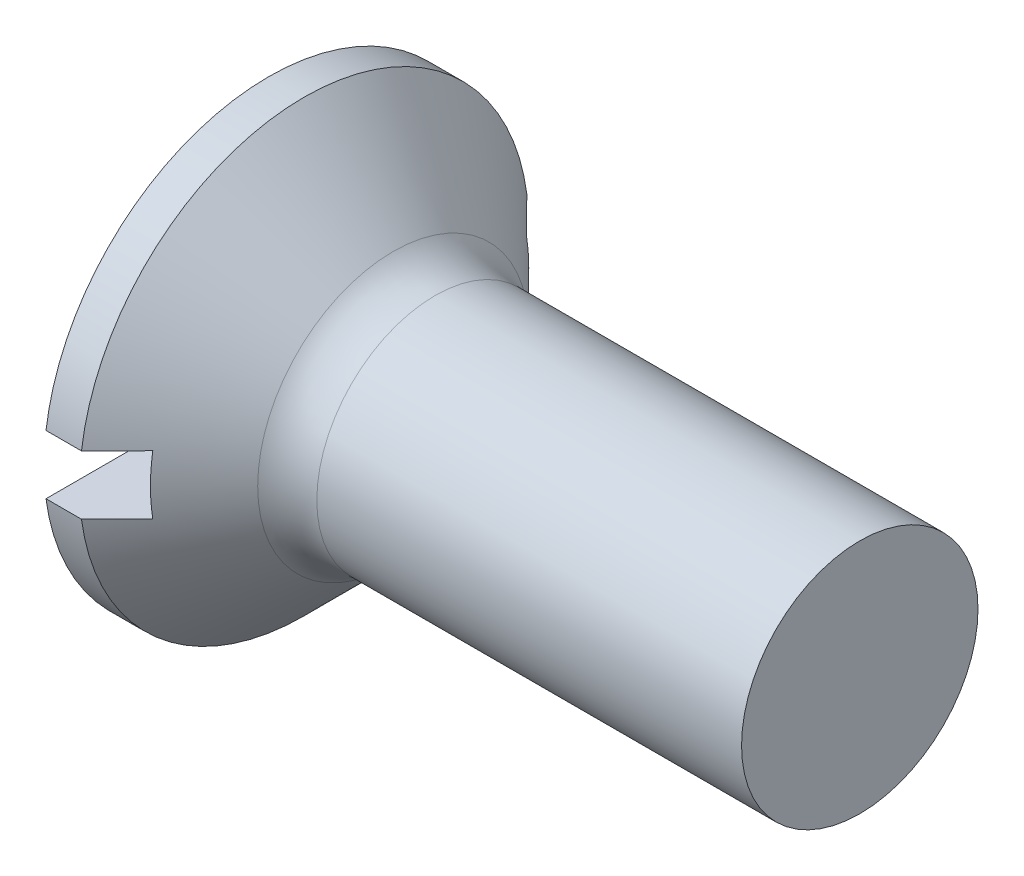
ISO-10303-21;
HEADER;
FILE_DESCRIPTION(('STEP AP214'),'2;1');
FILE_NAME('part.step','',(''),(''),'','','');
FILE_SCHEMA(('AUTOMOTIVE_DESIGN { 1 0 10303 214 1 1 1 1 }'));
ENDSEC;
DATA;
#1=APPLICATION_CONTEXT('core data for automotive mechanical design processes');
#2=APPLICATION_PROTOCOL_DEFINITION('international standard','automotive_design',2000,#1);
#3=PRODUCT_CONTEXT('',#1,'mechanical');
#4=PRODUCT('Part','Part','',(#3));
#5=PRODUCT_RELATED_PRODUCT_CATEGORY('part','',(#4));
#6=PRODUCT_DEFINITION_FORMATION('','',#4);
#7=PRODUCT_DEFINITION_CONTEXT('part definition',#1,'design');
#8=PRODUCT_DEFINITION('design','',#6,#7);
#9=PRODUCT_DEFINITION_SHAPE('','',#8);
#10=(LENGTH_UNIT() NAMED_UNIT(*) SI_UNIT(.MILLI.,.METRE.));
#11=(NAMED_UNIT(*) PLANE_ANGLE_UNIT() SI_UNIT($,.RADIAN.));
#12=(NAMED_UNIT(*) SI_UNIT($,.STERADIAN.) SOLID_ANGLE_UNIT());
#13=UNCERTAINTY_MEASURE_WITH_UNIT(LENGTH_MEASURE(1.E-05),#10,'distance_accuracy_value','');
#14=(GEOMETRIC_REPRESENTATION_CONTEXT(3) GLOBAL_UNCERTAINTY_ASSIGNED_CONTEXT((#13)) GLOBAL_UNIT_ASSIGNED_CONTEXT((#10,
#11,#12)) REPRESENTATION_CONTEXT('',''));
#15=CARTESIAN_POINT('',(0.,0.,0.));
#16=DIRECTION('',(0.,0.,1.));
#17=DIRECTION('',(1.,0.,0.));
#18=AXIS2_PLACEMENT_3D('',#15,#16,#17);
#19=CARTESIAN_POINT('',(0.,0.,0.));
#20=DIRECTION('',(-1.,0.,0.));
#21=DIRECTION('',(0.,0.,1.));
#22=AXIS2_PLACEMENT_3D('',#19,#20,#21);
#23=PLANE('',#22);
#24=DIRECTION('',(0.,0.,-1.));
#25=VECTOR('',#24,1.);
#26=CARTESIAN_POINT('',(0.,0.25,1.9));
#27=LINE('',#26,#25);
#28=CARTESIAN_POINT('',(0.,0.25,1.88348082018374));
#29=VERTEX_POINT('',#28);
#30=CARTESIAN_POINT('',(0.,0.25,-1.88348082018374));
#31=VERTEX_POINT('',#30);
#32=EDGE_CURVE('E176',#29,#31,#27,.T.);
#33=ORIENTED_EDGE('',*,*,#32,.F.);
#34=CARTESIAN_POINT('',(0.,0.,0.));
#35=DIRECTION('',(-1.,0.,0.));
#36=DIRECTION('',(0.,0.,1.));
#37=AXIS2_PLACEMENT_3D('',#34,#35,#36);
#38=CIRCLE('',#37,1.9);
#39=EDGE_CURVE('E141',#29,#31,#38,.T.);
#40=ORIENTED_EDGE('',*,*,#39,.T.);
#41=EDGE_LOOP('',(#33,#40));
#42=FACE_BOUND('',#41,.T.);
#43=ADVANCED_FACE('F35',(#42),#23,.T.);
#44=CARTESIAN_POINT('',(-6.34999999999999,0.,0.));
#45=DIRECTION('',(-1.,0.,0.));
#46=DIRECTION('',(0.,0.,1.));
#47=AXIS2_PLACEMENT_3D('',#44,#45,#46);
#48=CYLINDRICAL_SURFACE('',#47,1.9);
#49=DIRECTION('',(-1.,0.,0.));
#50=VECTOR('',#49,1.);
#51=CARTESIAN_POINT('',(-6.34999999999999,0.25,-1.88348082018374));
#52=LINE('',#51,#50);
#53=CARTESIAN_POINT('',(0.299999999999989,0.25,-1.88348082018376));
#54=VERTEX_POINT('',#53);
#55=EDGE_CURVE('E63',#31,#54,#52,.F.);
#56=ORIENTED_EDGE('',*,*,#55,.F.);
#57=ORIENTED_EDGE('',*,*,#39,.F.);
#58=DIRECTION('',(-1.,0.,0.));
#59=VECTOR('',#58,1.);
#60=CARTESIAN_POINT('',(-6.34999999999999,0.25,1.88348082018374));
#61=LINE('',#60,#59);
#62=CARTESIAN_POINT('',(0.300000000000003,0.25,1.88348082018374));
#63=VERTEX_POINT('',#62);
#64=EDGE_CURVE('E182',#63,#29,#61,.T.);
#65=ORIENTED_EDGE('',*,*,#64,.F.);
#66=CARTESIAN_POINT('',(0.300000000000003,0.,0.));
#67=DIRECTION('',(-1.,0.,0.));
#68=DIRECTION('',(0.,0.,1.));
#69=AXIS2_PLACEMENT_3D('',#66,#67,#68);
#70=CIRCLE('',#69,1.9);
#71=EDGE_CURVE('E112',#63,#54,#70,.T.);
#72=ORIENTED_EDGE('',*,*,#71,.T.);
#73=EDGE_LOOP('',(#56,#57,#65,#72));
#74=FACE_BOUND('',#73,.T.);
#75=ADVANCED_FACE('F163',(#74),#48,.T.);
#76=DIRECTION('',(0.,0.,1.));
#77=VECTOR('',#76,1.);
#78=CARTESIAN_POINT('',(0.,-0.250000000000001,-1.9));
#79=LINE('',#78,#77);
#80=CARTESIAN_POINT('',(0.,-0.250000000000001,-1.88348082018374));
#81=VERTEX_POINT('',#80);
#82=CARTESIAN_POINT('',(0.,-0.250000000000001,1.88348082018374));
#83=VERTEX_POINT('',#82);
#84=EDGE_CURVE('E106',#81,#83,#79,.T.);
#85=ORIENTED_EDGE('',*,*,#84,.F.);
#86=EDGE_CURVE('E131',#81,#83,#38,.T.);
#87=ORIENTED_EDGE('',*,*,#86,.T.);
#88=EDGE_LOOP('',(#85,#87));
#89=FACE_BOUND('',#88,.T.);
#90=ADVANCED_FACE('F161',(#89),#23,.T.);
#91=DIRECTION('',(-1.,0.,0.));
#92=VECTOR('',#91,1.);
#93=CARTESIAN_POINT('',(-6.34999999999999,-0.250000000000001,1.88348082018374));
#94=LINE('',#93,#92);
#95=CARTESIAN_POINT('',(0.299999999999989,-0.250000000000001,1.88348082018376));
#96=VERTEX_POINT('',#95);
#97=EDGE_CURVE('E132',#83,#96,#94,.F.);
#98=ORIENTED_EDGE('',*,*,#97,.F.);
#99=ORIENTED_EDGE('',*,*,#86,.F.);
#100=DIRECTION('',(-1.,0.,0.));
#101=VECTOR('',#100,1.);
#102=CARTESIAN_POINT('',(-6.34999999999999,-0.250000000000001,-1.88348082018374));
#103=LINE('',#102,#101);
#104=CARTESIAN_POINT('',(0.300000000000003,-0.250000000000001,-1.88348082018374));
#105=VERTEX_POINT('',#104);
#106=EDGE_CURVE('E121',#105,#81,#103,.T.);
#107=ORIENTED_EDGE('',*,*,#106,.F.);
#108=EDGE_CURVE('E129',#105,#96,#70,.T.);
#109=ORIENTED_EDGE('',*,*,#108,.T.);
#110=EDGE_LOOP('',(#98,#99,#107,#109));
#111=FACE_BOUND('',#110,.T.);
#112=ADVANCED_FACE('F128',(#111),#48,.T.);
#113=CARTESIAN_POINT('',(0.300000000000003,0.,0.));
#114=DIRECTION('',(-1.,0.,0.));
#115=DIRECTION('',(0.,0.,1.));
#116=AXIS2_PLACEMENT_3D('',#113,#114,#115);
#117=CONICAL_SURFACE('',#116,1.9,0.78539816339745);
#118=CARTESIAN_POINT('',(-1.98729422630551,0.25,-4.17982451038935));
#119=CARTESIAN_POINT('',(-1.84470913533547,0.25,-4.03698256603225));
#120=CARTESIAN_POINT('',(-1.70213517655014,0.25,-3.89412950070456));
#121=CARTESIAN_POINT('',(-1.41702186757104,0.25,-3.60838492143172));
#122=CARTESIAN_POINT('',(-1.27448251787976,0.25,-3.46549340698522));
#123=CARTESIAN_POINT('',(-0.989410499152169,0.25,-3.17961533117565));
#124=CARTESIAN_POINT('',(-0.846877845892992,0.25,-3.03662875407935));
#125=CARTESIAN_POINT('',(-0.561891165052778,0.25,-2.75058105917093));
#126=CARTESIAN_POINT('',(-0.419437136443918,0.25,-2.60751994238315));
#127=CARTESIAN_POINT('',(-0.131064292348537,0.25,-2.3176668049941));
#128=CARTESIAN_POINT('',(0.0148513539907664,0.25,-2.17087163179214));
#129=CARTESIAN_POINT('',(0.306462720413094,0.25,-1.87705115433807));
#130=CARTESIAN_POINT('',(0.452158431570259,0.25,-1.73002584121432));
#131=CARTESIAN_POINT('',(0.670327706151663,0.25,-1.50914686476255));
#132=CARTESIAN_POINT('',(0.742981250797221,0.25,-1.43547100609828));
#133=CARTESIAN_POINT('',(0.888099107922326,0.25,-1.28793053976864));
#134=CARTESIAN_POINT('',(0.960563417404761,0.25,-1.21406592915002));
#135=CARTESIAN_POINT('',(1.10516444224742,0.25,-1.0660275832816));
#136=CARTESIAN_POINT('',(1.17730118131636,0.25,-0.991853871173734));
#137=CARTESIAN_POINT('',(1.32099236723619,0.25,-0.84294514457437));
#138=CARTESIAN_POINT('',(1.39254683400264,0.25,-0.768210149450102));
#139=CARTESIAN_POINT('',(1.4825658678815,0.25,-0.672500233502236));
#140=CARTESIAN_POINT('',(1.50165114242041,0.25,-0.652110555381362));
#141=CARTESIAN_POINT('',(1.53968572913894,0.25,-0.611204724741305));
#142=CARTESIAN_POINT('',(1.55863503934745,0.25,-0.590688570396564));
#143=CARTESIAN_POINT('',(1.61514621539087,0.25,-0.528993825768736));
#144=CARTESIAN_POINT('',(1.65245554131459,0.25,-0.487580016311415));
#145=CARTESIAN_POINT('',(1.71225207904246,0.25,-0.419002643341745));
#146=CARTESIAN_POINT('',(1.73514735441112,0.25,-0.392195572563958));
#147=CARTESIAN_POINT('',(1.78011117382062,0.25,-0.337713683602133));
#148=CARTESIAN_POINT('',(1.80217634783667,0.25,-0.310036023298933));
#149=CARTESIAN_POINT('',(1.83405852164685,0.25,-0.26739675000213));
#150=CARTESIAN_POINT('',(1.84452887870795,0.25,-0.252926956129676));
#151=CARTESIAN_POINT('',(1.86480829380391,0.25,-0.223534103212474));
#152=CARTESIAN_POINT('',(1.87461759974615,0.25,-0.208611217166218));
#153=CARTESIAN_POINT('',(1.8932192565572,0.25,-0.178209466122465));
#154=CARTESIAN_POINT('',(1.90201523879352,0.25,-0.162732864604354));
#155=CARTESIAN_POINT('',(1.91807920679254,0.25,-0.13101950257968));
#156=CARTESIAN_POINT('',(1.92535000548919,0.25,-0.114784210217757));
#157=CARTESIAN_POINT('',(1.93762411485741,0.25,-0.0811668178626109));
#158=CARTESIAN_POINT('',(1.94259388017706,0.25,-0.063771739928644));
#159=CARTESIAN_POINT('',(1.94897989324943,0.25,-0.0284090713434214));
#160=CARTESIAN_POINT('',(1.95042002284216,0.25,-0.0104461659975856));
#161=CARTESIAN_POINT('',(1.94935644177881,0.25,0.0253992115742553));
#162=CARTESIAN_POINT('',(1.94684232540985,0.25,0.0432813469747596));
#163=CARTESIAN_POINT('',(1.93857592035239,0.25,0.0783510961631234));
#164=CARTESIAN_POINT('',(1.93280079704993,0.25,0.0955328861954527));
#165=CARTESIAN_POINT('',(1.91770670146767,0.25,0.13239784224318));
#166=CARTESIAN_POINT('',(1.9079044408816,0.25,0.151873654550218));
#167=CARTESIAN_POINT('',(1.88649113904698,0.25,0.189823155713473));
#168=CARTESIAN_POINT('',(1.87487561835218,0.25,0.208294205813897));
#169=CARTESIAN_POINT('',(1.85048324573877,0.25,0.244630361241057));
#170=CARTESIAN_POINT('',(1.83769879997766,0.25,0.262490290681415));
#171=CARTESIAN_POINT('',(1.81145322289458,0.25,0.297663877372688));
#172=CARTESIAN_POINT('',(1.79799297686919,0.25,0.314978203315155));
#173=CARTESIAN_POINT('',(1.75268964976738,0.25,0.371705919805397));
#174=CARTESIAN_POINT('',(1.71987651897858,0.25,0.410338972117884));
#175=CARTESIAN_POINT('',(1.65317458420771,0.25,0.486669402340337));
#176=CARTESIAN_POINT('',(1.61928533509996,0.25,0.524366381254672));
#177=CARTESIAN_POINT('',(1.55085976422305,0.25,0.599263041541323));
#178=CARTESIAN_POINT('',(1.51632262726528,0.25,0.636461979186223));
#179=CARTESIAN_POINT('',(1.44689518246044,0.25,0.710513545392871));
#180=CARTESIAN_POINT('',(1.41200494274365,0.25,0.747366238211863));
#181=CARTESIAN_POINT('',(1.30742637842109,0.25,0.857140556571603));
#182=CARTESIAN_POINT('',(1.23740074911625,0.25,0.929740569735702));
#183=CARTESIAN_POINT('',(1.09696472004179,0.25,1.07446651412946));
#184=CARTESIAN_POINT('',(1.02655462439956,0.25,1.14659274200916));
#185=CARTESIAN_POINT('',(0.834911887632562,0.25,1.3422369404478));
#186=CARTESIAN_POINT('',(0.713439687475853,0.25,1.46552022087721));
#187=CARTESIAN_POINT('',(0.470171078890065,0.25,1.71176788410888));
#188=CARTESIAN_POINT('',(0.34837466740016,0.25,1.83473226387866));
#189=CARTESIAN_POINT('',(-0.0173554901470557,0.25,2.20344593303904));
#190=CARTESIAN_POINT('',(-0.261551044831605,0.25,2.44893553827728));
#191=CARTESIAN_POINT('',(-0.752635037725528,0.25,2.94211353931879));
#192=CARTESIAN_POINT('',(-0.999526011157529,0.25,3.18979940617476));
#193=CARTESIAN_POINT('',(-1.49336982157244,0.25,3.68493789949824));
#194=CARTESIAN_POINT('',(-1.74032260728228,0.25,3.9323905770972));
#195=CARTESIAN_POINT('',(-1.98729422630551,0.25,4.17982451038934));
#196=B_SPLINE_CURVE_WITH_KNOTS('',3,(#118,#119,#120,#121,#122,#123,#124,#125,#126,#127,#128,
#129,#130,#131,#132,#133,#134,#135,#136,#137,#138,#139,#140,#141,#142,#143,#144,#145,#146,#147,
#148,#149,#150,#151,#152,#153,#154,#155,#156,#157,#158,#159,#160,#161,#162,#163,#164,#165,#166,
#167,#168,#169,#170,#171,#172,#173,#174,#175,#176,#177,#178,#179,#180,#181,#182,#183,#184,#185,
#186,#187,#188,#189,#190,#191,#192,#193,#194,#195),.UNSPECIFIED.,.F.,.F.,(4,2,2,2,2,2,2,2,2,2,2,
2,2,2,2,2,2,2,2,2,2,2,2,2,2,2,2,2,2,2,2,2,2,2,2,2,2,2,4),(0.,0.605482431225346,1.21097318233229,
1.81665168711006,2.42232207714462,3.04325825770119,3.66421899502984,3.9746379866888,
4.28506186531045,4.59546290620963,4.90585328539815,4.98963728022583,5.0734224872371,
5.24062546089035,5.34637861192141,5.45252280357737,5.50609279605942,5.55964258562074,
5.61299407520157,5.66624628494618,5.72025211290859,5.77389151113381,5.82767229932756,
5.88183443280842,5.94707677036331,6.01248290927082,6.07834909802315,6.14413114583103,
6.29613571362599,6.44820399733714,6.60047850521135,6.75272417196467,7.0553230067041,
7.35770972427607,7.87692671428236,8.39614862363949,9.43493043579255,10.4840877501042,
11.5328806536616),.UNSPECIFIED.);
#197=CARTESIAN_POINT('',(0.6,0.25,-1.58034806292791));
#198=VERTEX_POINT('',#197);
#199=EDGE_CURVE('E11',#54,#198,#196,.T.);
#200=ORIENTED_EDGE('',*,*,#199,.F.);
#201=ORIENTED_EDGE('',*,*,#71,.F.);
#202=CARTESIAN_POINT('',(0.6,0.25,1.58034806292791));
#203=VERTEX_POINT('',#202);
#204=EDGE_CURVE('E39',#203,#63,#196,.T.);
#205=ORIENTED_EDGE('',*,*,#204,.F.);
#206=CARTESIAN_POINT('',(0.6,0.,0.));
#207=DIRECTION('',(-1.,0.,0.));
#208=DIRECTION('',(0.,0.,1.));
#209=AXIS2_PLACEMENT_3D('',#206,#207,#208);
#210=CIRCLE('',#209,1.6);
#211=CARTESIAN_POINT('',(0.6,-0.250000000000001,1.58034806292791));
#212=VERTEX_POINT('',#211);
#213=EDGE_CURVE('E92',#203,#212,#210,.F.);
#214=ORIENTED_EDGE('',*,*,#213,.T.);
#215=CARTESIAN_POINT('',(-1.98729422630551,-0.250000000000001,4.17982451038935));
#216=CARTESIAN_POINT('',(-1.84470913533547,-0.250000000000001,4.03698256603225));
#217=CARTESIAN_POINT('',(-1.70213517655014,-0.250000000000001,3.89412950070456));
#218=CARTESIAN_POINT('',(-1.41702186757104,-0.250000000000001,3.60838492143172));
#219=CARTESIAN_POINT('',(-1.27448251787976,-0.250000000000001,3.46549340698522));
#220=CARTESIAN_POINT('',(-0.989410499152169,-0.250000000000001,3.17961533117565));
#221=CARTESIAN_POINT('',(-0.846877845892993,-0.250000000000001,3.03662875407935));
#222=CARTESIAN_POINT('',(-0.56189116505278,-0.250000000000001,2.75058105917093));
#223=CARTESIAN_POINT('',(-0.419437136443919,-0.250000000000001,2.60751994238315));
#224=CARTESIAN_POINT('',(-0.131064292348538,-0.250000000000001,2.3176668049941));
#225=CARTESIAN_POINT('',(0.0148513539907651,-0.250000000000001,2.17087163179215));
#226=CARTESIAN_POINT('',(0.306462720413092,-0.250000000000001,1.87705115433807));
#227=CARTESIAN_POINT('',(0.452158431570258,-0.250000000000001,1.73002584121432));
#228=CARTESIAN_POINT('',(0.670327706151662,-0.250000000000001,1.50914686476255));
#229=CARTESIAN_POINT('',(0.74298125079722,-0.250000000000001,1.43547100609828));
#230=CARTESIAN_POINT('',(0.888099107922325,-0.250000000000001,1.28793053976864));
#231=CARTESIAN_POINT('',(0.960563417404761,-0.250000000000001,1.21406592915002));
#232=CARTESIAN_POINT('',(1.10516444224742,-0.250000000000001,1.0660275832816));
#233=CARTESIAN_POINT('',(1.17730118131636,-0.250000000000001,0.991853871173734));
#234=CARTESIAN_POINT('',(1.32099236723619,-0.250000000000001,0.84294514457437));
#235=CARTESIAN_POINT('',(1.39254683400264,-0.250000000000001,0.768210149450102));
#236=CARTESIAN_POINT('',(1.4825658678815,-0.250000000000001,0.672500233502236));
#237=CARTESIAN_POINT('',(1.50165114242041,-0.250000000000001,0.652110555381362));
#238=CARTESIAN_POINT('',(1.53968572913894,-0.250000000000001,0.611204724741305));
#239=CARTESIAN_POINT('',(1.55863503934745,-0.250000000000001,0.590688570396564));
#240=CARTESIAN_POINT('',(1.61514621539087,-0.250000000000001,0.528993825768736));
#241=CARTESIAN_POINT('',(1.65245554131459,-0.250000000000001,0.487580016311415));
#242=CARTESIAN_POINT('',(1.71225207904246,-0.250000000000001,0.419002643341745));
#243=CARTESIAN_POINT('',(1.73514735441111,-0.250000000000001,0.392195572563957));
#244=CARTESIAN_POINT('',(1.78011117382062,-0.250000000000001,0.337713683602133));
#245=CARTESIAN_POINT('',(1.80217634783667,-0.250000000000001,0.310036023298933));
#246=CARTESIAN_POINT('',(1.83405852164685,-0.250000000000001,0.26739675000213));
#247=CARTESIAN_POINT('',(1.84452887870795,-0.250000000000001,0.252926956129675));
#248=CARTESIAN_POINT('',(1.86480829380391,-0.250000000000001,0.223534103212473));
#249=CARTESIAN_POINT('',(1.87461759974615,-0.250000000000001,0.208611217166217));
#250=CARTESIAN_POINT('',(1.8932192565572,-0.250000000000001,0.178209466122464));
#251=CARTESIAN_POINT('',(1.90201523879352,-0.250000000000001,0.162732864604353));
#252=CARTESIAN_POINT('',(1.91807920679254,-0.250000000000001,0.131019502579679));
#253=CARTESIAN_POINT('',(1.92535000548919,-0.250000000000001,0.114784210217756));
#254=CARTESIAN_POINT('',(1.93762411485741,-0.250000000000001,0.0811668178626096));
#255=CARTESIAN_POINT('',(1.94259388017706,-0.250000000000001,0.0637717399286428));
#256=CARTESIAN_POINT('',(1.94897989324943,-0.250000000000001,0.0284090713434201));
#257=CARTESIAN_POINT('',(1.95042002284216,-0.250000000000001,0.0104461659975843));
#258=CARTESIAN_POINT('',(1.94935644177881,-0.250000000000001,-0.0253992115742565));
#259=CARTESIAN_POINT('',(1.94684232540985,-0.250000000000001,-0.0432813469747608));
#260=CARTESIAN_POINT('',(1.93857592035239,-0.250000000000001,-0.0783510961631245));
#261=CARTESIAN_POINT('',(1.93280079704993,-0.250000000000001,-0.0955328861954537));
#262=CARTESIAN_POINT('',(1.91770670146766,-0.250000000000001,-0.132397842243181));
#263=CARTESIAN_POINT('',(1.9079044408816,-0.250000000000001,-0.15187365455022));
#264=CARTESIAN_POINT('',(1.88649113904698,-0.250000000000001,-0.189823155713475));
#265=CARTESIAN_POINT('',(1.87487561835218,-0.250000000000001,-0.208294205813898));
#266=CARTESIAN_POINT('',(1.85048324573876,-0.250000000000001,-0.244630361241059));
#267=CARTESIAN_POINT('',(1.83769879997766,-0.250000000000001,-0.262490290681418));
#268=CARTESIAN_POINT('',(1.81145322289457,-0.250000000000001,-0.29766387737269));
#269=CARTESIAN_POINT('',(1.79799297686919,-0.250000000000001,-0.314978203315158));
#270=CARTESIAN_POINT('',(1.75268964976738,-0.250000000000001,-0.3717059198054));
#271=CARTESIAN_POINT('',(1.71987651897858,-0.250000000000001,-0.410338972117888));
#272=CARTESIAN_POINT('',(1.6531745842077,-0.250000000000001,-0.486669402340342));
#273=CARTESIAN_POINT('',(1.61928533509996,-0.250000000000001,-0.524366381254677));
#274=CARTESIAN_POINT('',(1.55085976422304,-0.250000000000001,-0.599263041541329));
#275=CARTESIAN_POINT('',(1.51632262726528,-0.250000000000001,-0.636461979186229));
#276=CARTESIAN_POINT('',(1.44689518246043,-0.250000000000001,-0.710513545392877));
#277=CARTESIAN_POINT('',(1.41200494274364,-0.250000000000001,-0.74736623821187));
#278=CARTESIAN_POINT('',(1.30742637842108,-0.250000000000001,-0.857140556571611));
#279=CARTESIAN_POINT('',(1.23740074911624,-0.250000000000001,-0.92974056973571));
#280=CARTESIAN_POINT('',(1.09696472004178,-0.250000000000001,-1.07446651412947));
#281=CARTESIAN_POINT('',(1.02655462439955,-0.250000000000001,-1.14659274200917));
#282=CARTESIAN_POINT('',(0.83491188763255,-0.250000000000001,-1.34223694044781));
#283=CARTESIAN_POINT('',(0.713439687475841,-0.250000000000001,-1.46552022087722));
#284=CARTESIAN_POINT('',(0.470171078890054,-0.250000000000001,-1.71176788410889));
#285=CARTESIAN_POINT('',(0.348374667400149,-0.250000000000001,-1.83473226387867));
#286=CARTESIAN_POINT('',(-0.0173554901470656,-0.250000000000001,-2.20344593303905));
#287=CARTESIAN_POINT('',(-0.261551044831614,-0.250000000000001,-2.44893553827729));
#288=CARTESIAN_POINT('',(-0.752635037725536,-0.250000000000001,-2.9421135393188));
#289=CARTESIAN_POINT('',(-0.999526011157535,-0.250000000000001,-3.18979940617476));
#290=CARTESIAN_POINT('',(-1.49336982157245,-0.250000000000001,-3.68493789949824));
#291=CARTESIAN_POINT('',(-1.74032260728228,-0.250000000000001,-3.9323905770972));
#292=CARTESIAN_POINT('',(-1.98729422630551,-0.250000000000001,-4.17982451038935));
#293=B_SPLINE_CURVE_WITH_KNOTS('',3,(#215,#216,#217,#218,#219,#220,#221,#222,#223,#224,#225,
#226,#227,#228,#229,#230,#231,#232,#233,#234,#235,#236,#237,#238,#239,#240,#241,#242,#243,#244,
#245,#246,#247,#248,#249,#250,#251,#252,#253,#254,#255,#256,#257,#258,#259,#260,#261,#262,#263,
#264,#265,#266,#267,#268,#269,#270,#271,#272,#273,#274,#275,#276,#277,#278,#279,#280,#281,#282,
#283,#284,#285,#286,#287,#288,#289,#290,#291,#292),.UNSPECIFIED.,.F.,.F.,(4,2,2,2,2,2,2,2,2,2,2,
2,2,2,2,2,2,2,2,2,2,2,2,2,2,2,2,2,2,2,2,2,2,2,2,2,2,2,4),(0.,0.605482431225346,1.21097318233229,
1.81665168711006,2.42232207714462,3.04325825770119,3.66421899502984,3.9746379866888,
4.28506186531045,4.59546290620963,4.90585328539815,4.98963728022583,5.0734224872371,
5.24062546089035,5.34637861192141,5.45252280357737,5.50609279605942,5.55964258562074,
5.61299407520157,5.66624628494618,5.72025211290859,5.77389151113381,5.82767229932756,
5.88183443280842,5.94707677036331,6.01248290927082,6.07834909802315,6.14413114583103,
6.29613571362599,6.44820399733714,6.60047850521136,6.75272417196468,7.05532300670411,
7.35770972427609,7.87692671428238,8.3961486236395,9.43493043579256,10.4840877501042,
11.5328806536615),.UNSPECIFIED.);
#294=EDGE_CURVE('E100',#96,#212,#293,.T.);
#295=ORIENTED_EDGE('',*,*,#294,.F.);
#296=ORIENTED_EDGE('',*,*,#108,.F.);
#297=CARTESIAN_POINT('',(0.6,-0.250000000000001,-1.58034806292791));
#298=VERTEX_POINT('',#297);
#299=EDGE_CURVE('E49',#298,#105,#293,.T.);
#300=ORIENTED_EDGE('',*,*,#299,.F.);
#301=EDGE_CURVE('E103',#298,#198,#210,.F.);
#302=ORIENTED_EDGE('',*,*,#301,.T.);
#303=EDGE_LOOP('',(#200,#201,#205,#214,#295,#296,#300,#302));
#304=FACE_BOUND('',#303,.T.);
#305=CARTESIAN_POINT('',(1.05355339059327,0.,0.));
#306=DIRECTION('',(-1.,0.,0.));
#307=DIRECTION('',(0.,0.,1.));
#308=AXIS2_PLACEMENT_3D('',#305,#306,#307);
#309=CIRCLE('',#308,1.14644660940673);
#310=CARTESIAN_POINT('',(1.05355339059327,0.,1.14644660940673));
#311=VERTEX_POINT('',#310);
#312=EDGE_CURVE('E142',#311,#311,#309,.T.);
#313=ORIENTED_EDGE('',*,*,#312,.T.);
#314=EDGE_LOOP('',(#313));
#315=FACE_BOUND('',#314,.T.);
#316=ADVANCED_FACE('F109',(#304,#315),#117,.T.);
#317=CARTESIAN_POINT('',(-6.34999999999999,0.,0.));
#318=DIRECTION('',(-1.,0.,0.));
#319=DIRECTION('',(0.,0.,1.));
#320=AXIS2_PLACEMENT_3D('',#317,#318,#319);
#321=CYLINDRICAL_SURFACE('',#320,1.);
#322=CARTESIAN_POINT('',(1.40710678118655,0.,0.));
#323=DIRECTION('',(-1.,0.,0.));
#324=DIRECTION('',(0.,0.,1.));
#325=AXIS2_PLACEMENT_3D('',#322,#323,#324);
#326=CIRCLE('',#325,1.);
#327=CARTESIAN_POINT('',(1.40710678118655,0.,1.));
#328=VERTEX_POINT('',#327);
#329=EDGE_CURVE('E101',#328,#328,#326,.F.);
#330=ORIENTED_EDGE('',*,*,#329,.T.);
#331=EDGE_LOOP('',(#330));
#332=FACE_BOUND('',#331,.T.);
#333=CARTESIAN_POINT('',(5.,0.,0.));
#334=DIRECTION('',(-1.,0.,0.));
#335=DIRECTION('',(0.,0.,1.));
#336=AXIS2_PLACEMENT_3D('',#333,#334,#335);
#337=CIRCLE('',#336,1.);
#338=CARTESIAN_POINT('',(5.,0.,1.));
#339=VERTEX_POINT('',#338);
#340=EDGE_CURVE('E134',#339,#339,#337,.T.);
#341=ORIENTED_EDGE('',*,*,#340,.T.);
#342=EDGE_LOOP('',(#341));
#343=FACE_BOUND('',#342,.T.);
#344=ADVANCED_FACE('F148',(#332,#343),#321,.T.);
#345=CARTESIAN_POINT('',(5.,1.,0.));
#346=DIRECTION('',(1.,0.,0.));
#347=DIRECTION('',(0.,0.,-1.));
#348=AXIS2_PLACEMENT_3D('',#345,#346,#347);
#349=PLANE('',#348);
#350=ORIENTED_EDGE('',*,*,#340,.F.);
#351=EDGE_LOOP('',(#350));
#352=FACE_BOUND('',#351,.T.);
#353=ADVANCED_FACE('F153',(#352),#349,.T.);
#354=CARTESIAN_POINT('',(1.40710678118655,0.,0.));
#355=DIRECTION('',(-1.,0.,0.));
#356=DIRECTION('',(0.,0.,1.));
#357=AXIS2_PLACEMENT_3D('',#354,#355,#356);
#358=TOROIDAL_SURFACE('',#357,1.5,0.5);
#359=ORIENTED_EDGE('',*,*,#329,.F.);
#360=EDGE_LOOP('',(#359));
#361=FACE_BOUND('',#360,.T.);
#362=ORIENTED_EDGE('',*,*,#312,.F.);
#363=EDGE_LOOP('',(#362));
#364=FACE_BOUND('',#363,.T.);
#365=ADVANCED_FACE('F37',(#361,#364),#358,.F.);
#366=CARTESIAN_POINT('',(0.6,0.25,1.9));
#367=DIRECTION('',(0.,1.,0.));
#368=DIRECTION('',(0.,0.,1.));
#369=AXIS2_PLACEMENT_3D('',#366,#367,#368);
#370=PLANE('',#369);
#371=ORIENTED_EDGE('',*,*,#55,.T.);
#372=ORIENTED_EDGE('',*,*,#199,.T.);
#373=DIRECTION('',(0.,0.,-1.));
#374=VECTOR('',#373,1.);
#375=CARTESIAN_POINT('',(0.6,0.25,1.9));
#376=LINE('',#375,#374);
#377=EDGE_CURVE('E95',#203,#198,#376,.T.);
#378=ORIENTED_EDGE('',*,*,#377,.F.);
#379=ORIENTED_EDGE('',*,*,#204,.T.);
#380=ORIENTED_EDGE('',*,*,#64,.T.);
#381=ORIENTED_EDGE('',*,*,#32,.T.);
#382=EDGE_LOOP('',(#371,#372,#378,#379,#380,#381));
#383=FACE_BOUND('',#382,.T.);
#384=ADVANCED_FACE('F104',(#383),#370,.F.);
#385=CARTESIAN_POINT('',(0.6,-0.250000000000001,-1.9));
#386=DIRECTION('',(0.,-1.,0.));
#387=DIRECTION('',(0.,0.,-1.));
#388=AXIS2_PLACEMENT_3D('',#385,#386,#387);
#389=PLANE('',#388);
#390=ORIENTED_EDGE('',*,*,#97,.T.);
#391=ORIENTED_EDGE('',*,*,#294,.T.);
#392=DIRECTION('',(0.,0.,1.));
#393=VECTOR('',#392,1.);
#394=CARTESIAN_POINT('',(0.6,-0.250000000000001,-1.9));
#395=LINE('',#394,#393);
#396=EDGE_CURVE('E56',#298,#212,#395,.T.);
#397=ORIENTED_EDGE('',*,*,#396,.F.);
#398=ORIENTED_EDGE('',*,*,#299,.T.);
#399=ORIENTED_EDGE('',*,*,#106,.T.);
#400=ORIENTED_EDGE('',*,*,#84,.T.);
#401=EDGE_LOOP('',(#390,#391,#397,#398,#399,#400));
#402=FACE_BOUND('',#401,.T.);
#403=ADVANCED_FACE('F120',(#402),#389,.F.);
#404=CARTESIAN_POINT('',(0.6,0.25,-1.9));
#405=DIRECTION('',(-1.,0.,0.));
#406=DIRECTION('',(0.,0.,1.));
#407=AXIS2_PLACEMENT_3D('',#404,#405,#406);
#408=PLANE('',#407);
#409=ORIENTED_EDGE('',*,*,#396,.T.);
#410=ORIENTED_EDGE('',*,*,#213,.F.);
#411=ORIENTED_EDGE('',*,*,#377,.T.);
#412=ORIENTED_EDGE('',*,*,#301,.F.);
#413=EDGE_LOOP('',(#409,#410,#411,#412));
#414=FACE_BOUND('',#413,.T.);
#415=ADVANCED_FACE('F94',(#414),#408,.T.);
#416=CLOSED_SHELL('',(#43,#75,#90,#112,#316,#344,#353,#365,#384,#403,#415));
#417=MANIFOLD_SOLID_BREP('B2',#416);
#418=ADVANCED_BREP_SHAPE_REPRESENTATION('',(#18,#417),#14);
#419=SHAPE_DEFINITION_REPRESENTATION(#9,#418);
ENDSEC;
END-ISO-10303-21;
